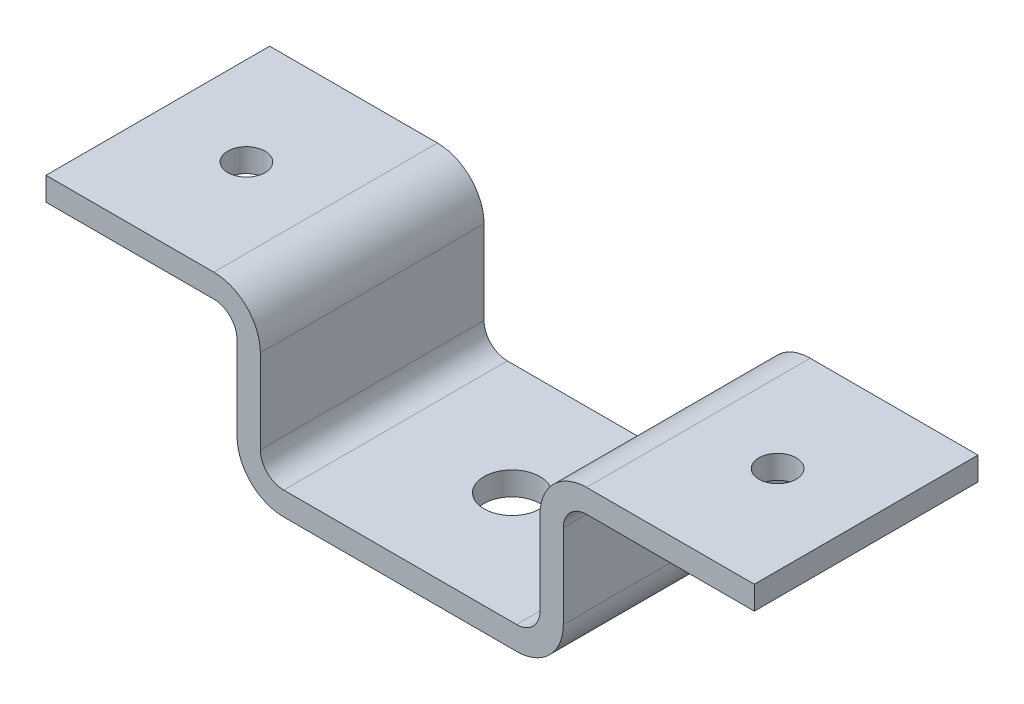
ISO-10303-21;
HEADER;
FILE_DESCRIPTION(('STEP AP214'),'2;1');
FILE_NAME('part.step','',(''),(''),'','','');
FILE_SCHEMA(('AUTOMOTIVE_DESIGN { 1 0 10303 214 1 1 1 1 }'));
ENDSEC;
DATA;
#1=APPLICATION_CONTEXT('core data for automotive mechanical design processes');
#2=APPLICATION_PROTOCOL_DEFINITION('international standard','automotive_design',2000,#1);
#3=PRODUCT_CONTEXT('',#1,'mechanical');
#4=PRODUCT('Part','Part','',(#3));
#5=PRODUCT_RELATED_PRODUCT_CATEGORY('part','',(#4));
#6=PRODUCT_DEFINITION_FORMATION('','',#4);
#7=PRODUCT_DEFINITION_CONTEXT('part definition',#1,'design');
#8=PRODUCT_DEFINITION('design','',#6,#7);
#9=PRODUCT_DEFINITION_SHAPE('','',#8);
#10=(LENGTH_UNIT() NAMED_UNIT(*) SI_UNIT(.MILLI.,.METRE.));
#11=(NAMED_UNIT(*) PLANE_ANGLE_UNIT() SI_UNIT($,.RADIAN.));
#12=(NAMED_UNIT(*) SI_UNIT($,.STERADIAN.) SOLID_ANGLE_UNIT());
#13=UNCERTAINTY_MEASURE_WITH_UNIT(LENGTH_MEASURE(1.E-05),#10,'distance_accuracy_value','');
#14=(GEOMETRIC_REPRESENTATION_CONTEXT(3) GLOBAL_UNCERTAINTY_ASSIGNED_CONTEXT((#13)) GLOBAL_UNIT_ASSIGNED_CONTEXT((#10,
#11,#12)) REPRESENTATION_CONTEXT('',''));
#15=CARTESIAN_POINT('',(0.,0.,0.));
#16=DIRECTION('',(0.,0.,1.));
#17=DIRECTION('',(1.,0.,0.));
#18=AXIS2_PLACEMENT_3D('',#15,#16,#17);
#19=CARTESIAN_POINT('',(0.,60.325,0.));
#20=DIRECTION('',(0.,-1.,0.));
#21=DIRECTION('',(0.,0.,-1.));
#22=AXIS2_PLACEMENT_3D('',#19,#20,#21);
#23=PLANE('',#22);
#24=CARTESIAN_POINT('',(30.1752,60.325,-38.1));
#25=DIRECTION('',(0.,1.,0.));
#26=DIRECTION('',(0.,0.,1.));
#27=AXIS2_PLACEMENT_3D('',#24,#25,#26);
#28=CIRCLE('',#27,6.35);
#29=CARTESIAN_POINT('',(30.1752,60.325,-31.75));
#30=VERTEX_POINT('',#29);
#31=EDGE_CURVE('E224',#30,#30,#28,.T.);
#32=ORIENTED_EDGE('',*,*,#31,.F.);
#33=EDGE_LOOP('',(#32));
#34=FACE_BOUND('',#33,.T.);
#35=DIRECTION('',(1.,0.,0.));
#36=VECTOR('',#35,1.);
#37=CARTESIAN_POINT('',(241.3,60.325,0.));
#38=LINE('',#37,#36);
#39=CARTESIAN_POINT('',(0.,60.325,0.));
#40=VERTEX_POINT('',#39);
#41=CARTESIAN_POINT('',(57.15,60.325,0.));
#42=VERTEX_POINT('',#41);
#43=EDGE_CURVE('E320',#40,#42,#38,.T.);
#44=ORIENTED_EDGE('',*,*,#43,.T.);
#45=DIRECTION('',(0.,0.,1.));
#46=VECTOR('',#45,1.);
#47=CARTESIAN_POINT('',(57.15,60.325,0.));
#48=LINE('',#47,#46);
#49=CARTESIAN_POINT('',(57.15,60.325,-76.2));
#50=VERTEX_POINT('',#49);
#51=EDGE_CURVE('E236',#42,#50,#48,.F.);
#52=ORIENTED_EDGE('',*,*,#51,.T.);
#53=DIRECTION('',(-1.,0.,0.));
#54=VECTOR('',#53,1.);
#55=CARTESIAN_POINT('',(0.,60.325,-76.2));
#56=LINE('',#55,#54);
#57=CARTESIAN_POINT('',(0.,60.325,-76.2));
#58=VERTEX_POINT('',#57);
#59=EDGE_CURVE('E326',#50,#58,#56,.T.);
#60=ORIENTED_EDGE('',*,*,#59,.T.);
#61=DIRECTION('',(0.,0.,1.));
#62=VECTOR('',#61,1.);
#63=CARTESIAN_POINT('',(0.,60.325,0.));
#64=LINE('',#63,#62);
#65=EDGE_CURVE('E207',#58,#40,#64,.T.);
#66=ORIENTED_EDGE('',*,*,#65,.T.);
#67=EDGE_LOOP('',(#44,#52,#60,#66));
#68=FACE_BOUND('',#67,.T.);
#69=ADVANCED_FACE('F43',(#34,#68),#23,.F.);
#70=CARTESIAN_POINT('',(241.3,60.325,0.));
#71=DIRECTION('',(0.,0.,-1.));
#72=DIRECTION('',(-1.,0.,0.));
#73=AXIS2_PLACEMENT_3D('',#70,#71,#72);
#74=PLANE('',#73);
#75=DIRECTION('',(0.,1.,0.));
#76=VECTOR('',#75,1.);
#77=CARTESIAN_POINT('',(65.0748,52.3748,0.));
#78=LINE('',#77,#76);
#79=CARTESIAN_POINT('',(65.0748,15.875,0.));
#80=VERTEX_POINT('',#79);
#81=CARTESIAN_POINT('',(65.0748,44.4246,0.));
#82=VERTEX_POINT('',#81);
#83=EDGE_CURVE('E194',#80,#82,#78,.T.);
#84=ORIENTED_EDGE('',*,*,#83,.F.);
#85=CARTESIAN_POINT('',(80.9498,15.875,0.));
#86=DIRECTION('',(0.,0.,-1.));
#87=DIRECTION('',(-1.,0.,0.));
#88=AXIS2_PLACEMENT_3D('',#85,#86,#87);
#89=CIRCLE('',#88,15.875);
#90=CARTESIAN_POINT('',(80.9498,0.,0.));
#91=VERTEX_POINT('',#90);
#92=EDGE_CURVE('E281',#80,#91,#89,.F.);
#93=ORIENTED_EDGE('',*,*,#92,.T.);
#94=DIRECTION('',(1.,0.,0.));
#95=VECTOR('',#94,1.);
#96=CARTESIAN_POINT('',(241.3,0.,0.));
#97=LINE('',#96,#95);
#98=CARTESIAN_POINT('',(160.3502,0.,0.));
#99=VERTEX_POINT('',#98);
#100=EDGE_CURVE('E319',#91,#99,#97,.T.);
#101=ORIENTED_EDGE('',*,*,#100,.T.);
#102=CARTESIAN_POINT('',(160.3502,15.875,0.));
#103=DIRECTION('',(0.,0.,-1.));
#104=DIRECTION('',(-1.,0.,0.));
#105=AXIS2_PLACEMENT_3D('',#102,#103,#104);
#106=CIRCLE('',#105,15.875);
#107=CARTESIAN_POINT('',(176.2252,15.875,0.));
#108=VERTEX_POINT('',#107);
#109=EDGE_CURVE('E270',#99,#108,#106,.F.);
#110=ORIENTED_EDGE('',*,*,#109,.T.);
#111=DIRECTION('',(0.,-1.,0.));
#112=VECTOR('',#111,1.);
#113=CARTESIAN_POINT('',(176.2252,52.3748,0.));
#114=LINE('',#113,#112);
#115=CARTESIAN_POINT('',(176.2252,44.4246,0.));
#116=VERTEX_POINT('',#115);
#117=EDGE_CURVE('E301',#116,#108,#114,.T.);
#118=ORIENTED_EDGE('',*,*,#117,.F.);
#119=CARTESIAN_POINT('',(184.1754,44.4246,0.));
#120=DIRECTION('',(0.,0.,-1.));
#121=DIRECTION('',(-1.,0.,0.));
#122=AXIS2_PLACEMENT_3D('',#119,#120,#121);
#123=CIRCLE('',#122,7.9502);
#124=CARTESIAN_POINT('',(184.1754,52.3748,0.));
#125=VERTEX_POINT('',#124);
#126=EDGE_CURVE('E51',#116,#125,#123,.T.);
#127=ORIENTED_EDGE('',*,*,#126,.T.);
#128=DIRECTION('',(-1.,0.,0.));
#129=VECTOR('',#128,1.);
#130=CARTESIAN_POINT('',(176.2252,52.3748,0.));
#131=LINE('',#130,#129);
#132=CARTESIAN_POINT('',(241.3,52.3748,0.));
#133=VERTEX_POINT('',#132);
#134=EDGE_CURVE('E310',#133,#125,#131,.T.);
#135=ORIENTED_EDGE('',*,*,#134,.F.);
#136=DIRECTION('',(0.,-1.,0.));
#137=VECTOR('',#136,1.);
#138=CARTESIAN_POINT('',(241.3,60.325,0.));
#139=LINE('',#138,#137);
#140=CARTESIAN_POINT('',(241.3,60.325,0.));
#141=VERTEX_POINT('',#140);
#142=EDGE_CURVE('E212',#141,#133,#139,.T.);
#143=ORIENTED_EDGE('',*,*,#142,.F.);
#144=CARTESIAN_POINT('',(184.15,60.325,0.));
#145=VERTEX_POINT('',#144);
#146=EDGE_CURVE('E324',#145,#141,#38,.T.);
#147=ORIENTED_EDGE('',*,*,#146,.F.);
#148=CARTESIAN_POINT('',(184.15,44.45,0.));
#149=DIRECTION('',(0.,0.,-1.));
#150=DIRECTION('',(-1.,0.,0.));
#151=AXIS2_PLACEMENT_3D('',#148,#149,#150);
#152=CIRCLE('',#151,15.875);
#153=CARTESIAN_POINT('',(168.275,44.45,0.));
#154=VERTEX_POINT('',#153);
#155=EDGE_CURVE('E261',#145,#154,#152,.F.);
#156=ORIENTED_EDGE('',*,*,#155,.T.);
#157=DIRECTION('',(0.,1.,0.));
#158=VECTOR('',#157,1.);
#159=CARTESIAN_POINT('',(168.275,7.9502,0.));
#160=LINE('',#159,#158);
#161=CARTESIAN_POINT('',(168.275,15.9004,0.));
#162=VERTEX_POINT('',#161);
#163=EDGE_CURVE('E353',#162,#154,#160,.T.);
#164=ORIENTED_EDGE('',*,*,#163,.F.);
#165=CARTESIAN_POINT('',(160.3248,15.9004,0.));
#166=DIRECTION('',(0.,0.,-1.));
#167=DIRECTION('',(-1.,0.,0.));
#168=AXIS2_PLACEMENT_3D('',#165,#166,#167);
#169=CIRCLE('',#168,7.9502);
#170=CARTESIAN_POINT('',(160.3248,7.9502,0.));
#171=VERTEX_POINT('',#170);
#172=EDGE_CURVE('E254',#162,#171,#169,.T.);
#173=ORIENTED_EDGE('',*,*,#172,.T.);
#174=DIRECTION('',(1.,0.,0.));
#175=VECTOR('',#174,1.);
#176=CARTESIAN_POINT('',(73.025,7.9502,0.));
#177=LINE('',#176,#175);
#178=CARTESIAN_POINT('',(80.9752,7.9502,0.));
#179=VERTEX_POINT('',#178);
#180=EDGE_CURVE('E204',#179,#171,#177,.T.);
#181=ORIENTED_EDGE('',*,*,#180,.F.);
#182=CARTESIAN_POINT('',(80.9752,15.9004,0.));
#183=DIRECTION('',(0.,0.,-1.));
#184=DIRECTION('',(-1.,0.,0.));
#185=AXIS2_PLACEMENT_3D('',#182,#183,#184);
#186=CIRCLE('',#185,7.9502);
#187=CARTESIAN_POINT('',(73.025,15.9004,0.));
#188=VERTEX_POINT('',#187);
#189=EDGE_CURVE('E245',#179,#188,#186,.T.);
#190=ORIENTED_EDGE('',*,*,#189,.T.);
#191=DIRECTION('',(0.,-1.,0.));
#192=VECTOR('',#191,1.);
#193=CARTESIAN_POINT('',(73.025,60.325,0.));
#194=LINE('',#193,#192);
#195=CARTESIAN_POINT('',(73.025,44.45,0.));
#196=VERTEX_POINT('',#195);
#197=EDGE_CURVE('E358',#196,#188,#194,.T.);
#198=ORIENTED_EDGE('',*,*,#197,.F.);
#199=CARTESIAN_POINT('',(57.15,44.45,0.));
#200=DIRECTION('',(0.,0.,-1.));
#201=DIRECTION('',(-1.,0.,0.));
#202=AXIS2_PLACEMENT_3D('',#199,#200,#201);
#203=CIRCLE('',#202,15.875);
#204=EDGE_CURVE('E234',#196,#42,#203,.F.);
#205=ORIENTED_EDGE('',*,*,#204,.T.);
#206=ORIENTED_EDGE('',*,*,#43,.F.);
#207=DIRECTION('',(0.,-1.,0.));
#208=VECTOR('',#207,1.);
#209=CARTESIAN_POINT('',(0.,60.325,0.));
#210=LINE('',#209,#208);
#211=CARTESIAN_POINT('',(0.,52.3748,0.));
#212=VERTEX_POINT('',#211);
#213=EDGE_CURVE('E209',#40,#212,#210,.T.);
#214=ORIENTED_EDGE('',*,*,#213,.T.);
#215=DIRECTION('',(-1.,0.,0.));
#216=VECTOR('',#215,1.);
#217=CARTESIAN_POINT('',(0.,52.3748,0.));
#218=LINE('',#217,#216);
#219=CARTESIAN_POINT('',(57.1246,52.3748,0.));
#220=VERTEX_POINT('',#219);
#221=EDGE_CURVE('E200',#220,#212,#218,.T.);
#222=ORIENTED_EDGE('',*,*,#221,.F.);
#223=CARTESIAN_POINT('',(57.1246,44.4246,0.));
#224=DIRECTION('',(0.,0.,-1.));
#225=DIRECTION('',(-1.,0.,0.));
#226=AXIS2_PLACEMENT_3D('',#223,#224,#225);
#227=CIRCLE('',#226,7.9502);
#228=EDGE_CURVE('E291',#220,#82,#227,.T.);
#229=ORIENTED_EDGE('',*,*,#228,.T.);
#230=EDGE_LOOP('',(#84,#93,#101,#110,#118,#127,#135,#143,#147,#156,#164,#173,#181,#190,#198,
#205,#206,#214,#222,#229));
#231=FACE_BOUND('',#230,.T.);
#232=ADVANCED_FACE('F306',(#231),#74,.F.);
#233=CARTESIAN_POINT('',(241.3,60.325,-76.2));
#234=DIRECTION('',(-1.,0.,0.));
#235=DIRECTION('',(0.,0.,1.));
#236=AXIS2_PLACEMENT_3D('',#233,#234,#235);
#237=PLANE('',#236);
#238=ORIENTED_EDGE('',*,*,#142,.T.);
#239=DIRECTION('',(0.,0.,1.));
#240=VECTOR('',#239,1.);
#241=CARTESIAN_POINT('',(241.3,52.3748,-76.2));
#242=LINE('',#241,#240);
#243=CARTESIAN_POINT('',(241.3,52.3748,-76.2));
#244=VERTEX_POINT('',#243);
#245=EDGE_CURVE('E317',#244,#133,#242,.T.);
#246=ORIENTED_EDGE('',*,*,#245,.F.);
#247=DIRECTION('',(0.,-1.,0.));
#248=VECTOR('',#247,1.);
#249=CARTESIAN_POINT('',(241.3,60.325,-76.2));
#250=LINE('',#249,#248);
#251=CARTESIAN_POINT('',(241.3,60.325,-76.2));
#252=VERTEX_POINT('',#251);
#253=EDGE_CURVE('E208',#252,#244,#250,.T.);
#254=ORIENTED_EDGE('',*,*,#253,.F.);
#255=DIRECTION('',(0.,0.,-1.));
#256=VECTOR('',#255,1.);
#257=CARTESIAN_POINT('',(241.3,60.325,-76.2));
#258=LINE('',#257,#256);
#259=EDGE_CURVE('E323',#141,#252,#258,.T.);
#260=ORIENTED_EDGE('',*,*,#259,.F.);
#261=EDGE_LOOP('',(#238,#246,#254,#260));
#262=FACE_BOUND('',#261,.T.);
#263=ADVANCED_FACE('F342',(#262),#237,.F.);
#264=CARTESIAN_POINT('',(0.,60.325,-76.2));
#265=DIRECTION('',(0.,0.,1.));
#266=DIRECTION('',(1.,0.,0.));
#267=AXIS2_PLACEMENT_3D('',#264,#265,#266);
#268=PLANE('',#267);
#269=DIRECTION('',(-1.,0.,0.));
#270=VECTOR('',#269,1.);
#271=CARTESIAN_POINT('',(0.,0.,-76.2));
#272=LINE('',#271,#270);
#273=CARTESIAN_POINT('',(160.3502,0.,-76.2));
#274=VERTEX_POINT('',#273);
#275=CARTESIAN_POINT('',(80.9498,0.,-76.2));
#276=VERTEX_POINT('',#275);
#277=EDGE_CURVE('E331',#274,#276,#272,.T.);
#278=ORIENTED_EDGE('',*,*,#277,.T.);
#279=CARTESIAN_POINT('',(80.9498,15.875,-76.2));
#280=DIRECTION('',(0.,0.,1.));
#281=DIRECTION('',(1.,0.,0.));
#282=AXIS2_PLACEMENT_3D('',#279,#280,#281);
#283=CIRCLE('',#282,15.875);
#284=CARTESIAN_POINT('',(65.0748,15.875,-76.2));
#285=VERTEX_POINT('',#284);
#286=EDGE_CURVE('E285',#276,#285,#283,.F.);
#287=ORIENTED_EDGE('',*,*,#286,.T.);
#288=DIRECTION('',(0.,1.,0.));
#289=VECTOR('',#288,1.);
#290=CARTESIAN_POINT('',(65.0748,52.3748,-76.2));
#291=LINE('',#290,#289);
#292=CARTESIAN_POINT('',(65.0748,44.4246,-76.2));
#293=VERTEX_POINT('',#292);
#294=EDGE_CURVE('E193',#285,#293,#291,.T.);
#295=ORIENTED_EDGE('',*,*,#294,.T.);
#296=CARTESIAN_POINT('',(57.1246,44.4246,-76.2));
#297=DIRECTION('',(0.,0.,1.));
#298=DIRECTION('',(1.,0.,0.));
#299=AXIS2_PLACEMENT_3D('',#296,#297,#298);
#300=CIRCLE('',#299,7.9502);
#301=CARTESIAN_POINT('',(57.1246,52.3748,-76.2));
#302=VERTEX_POINT('',#301);
#303=EDGE_CURVE('E189',#293,#302,#300,.T.);
#304=ORIENTED_EDGE('',*,*,#303,.T.);
#305=DIRECTION('',(-1.,0.,0.));
#306=VECTOR('',#305,1.);
#307=CARTESIAN_POINT('',(0.,52.3748,-76.2));
#308=LINE('',#307,#306);
#309=CARTESIAN_POINT('',(0.,52.3748,-76.2));
#310=VERTEX_POINT('',#309);
#311=EDGE_CURVE('E179',#302,#310,#308,.T.);
#312=ORIENTED_EDGE('',*,*,#311,.T.);
#313=DIRECTION('',(0.,-1.,0.));
#314=VECTOR('',#313,1.);
#315=CARTESIAN_POINT('',(0.,60.325,-76.2));
#316=LINE('',#315,#314);
#317=EDGE_CURVE('E185',#58,#310,#316,.T.);
#318=ORIENTED_EDGE('',*,*,#317,.F.);
#319=ORIENTED_EDGE('',*,*,#59,.F.);
#320=CARTESIAN_POINT('',(57.15,44.45,-76.2));
#321=DIRECTION('',(0.,0.,1.));
#322=DIRECTION('',(1.,0.,0.));
#323=AXIS2_PLACEMENT_3D('',#320,#321,#322);
#324=CIRCLE('',#323,15.875);
#325=CARTESIAN_POINT('',(73.025,44.45,-76.2));
#326=VERTEX_POINT('',#325);
#327=EDGE_CURVE('E238',#50,#326,#324,.F.);
#328=ORIENTED_EDGE('',*,*,#327,.T.);
#329=DIRECTION('',(0.,-1.,0.));
#330=VECTOR('',#329,1.);
#331=CARTESIAN_POINT('',(73.025,60.325,-76.2));
#332=LINE('',#331,#330);
#333=CARTESIAN_POINT('',(73.025,15.9004,-76.2));
#334=VERTEX_POINT('',#333);
#335=EDGE_CURVE('E313',#326,#334,#332,.T.);
#336=ORIENTED_EDGE('',*,*,#335,.T.);
#337=CARTESIAN_POINT('',(80.9752,15.9004,-76.2));
#338=DIRECTION('',(0.,0.,1.));
#339=DIRECTION('',(1.,0.,0.));
#340=AXIS2_PLACEMENT_3D('',#337,#338,#339);
#341=CIRCLE('',#340,7.9502);
#342=CARTESIAN_POINT('',(80.9752,7.9502,-76.2));
#343=VERTEX_POINT('',#342);
#344=EDGE_CURVE('E247',#334,#343,#341,.T.);
#345=ORIENTED_EDGE('',*,*,#344,.T.);
#346=DIRECTION('',(1.,0.,0.));
#347=VECTOR('',#346,1.);
#348=CARTESIAN_POINT('',(73.025,7.9502,-76.2));
#349=LINE('',#348,#347);
#350=CARTESIAN_POINT('',(160.3248,7.9502,-76.2));
#351=VERTEX_POINT('',#350);
#352=EDGE_CURVE('E361',#343,#351,#349,.T.);
#353=ORIENTED_EDGE('',*,*,#352,.T.);
#354=CARTESIAN_POINT('',(160.3248,15.9004,-76.2));
#355=DIRECTION('',(0.,0.,1.));
#356=DIRECTION('',(1.,0.,0.));
#357=AXIS2_PLACEMENT_3D('',#354,#355,#356);
#358=CIRCLE('',#357,7.9502);
#359=CARTESIAN_POINT('',(168.275,15.9004,-76.2));
#360=VERTEX_POINT('',#359);
#361=EDGE_CURVE('E256',#351,#360,#358,.T.);
#362=ORIENTED_EDGE('',*,*,#361,.T.);
#363=DIRECTION('',(0.,1.,0.));
#364=VECTOR('',#363,1.);
#365=CARTESIAN_POINT('',(168.275,7.9502,-76.2));
#366=LINE('',#365,#364);
#367=CARTESIAN_POINT('',(168.275,44.45,-76.2));
#368=VERTEX_POINT('',#367);
#369=EDGE_CURVE('E368',#360,#368,#366,.T.);
#370=ORIENTED_EDGE('',*,*,#369,.T.);
#371=CARTESIAN_POINT('',(184.15,44.45,-76.2));
#372=DIRECTION('',(0.,0.,1.));
#373=DIRECTION('',(1.,0.,0.));
#374=AXIS2_PLACEMENT_3D('',#371,#372,#373);
#375=CIRCLE('',#374,15.875);
#376=CARTESIAN_POINT('',(184.15,60.325,-76.2));
#377=VERTEX_POINT('',#376);
#378=EDGE_CURVE('E265',#368,#377,#375,.F.);
#379=ORIENTED_EDGE('',*,*,#378,.T.);
#380=EDGE_CURVE('E327',#252,#377,#56,.T.);
#381=ORIENTED_EDGE('',*,*,#380,.F.);
#382=ORIENTED_EDGE('',*,*,#253,.T.);
#383=DIRECTION('',(-1.,0.,0.));
#384=VECTOR('',#383,1.);
#385=CARTESIAN_POINT('',(176.2252,52.3748,-76.2));
#386=LINE('',#385,#384);
#387=CARTESIAN_POINT('',(184.1754,52.3748,-76.2));
#388=VERTEX_POINT('',#387);
#389=EDGE_CURVE('E309',#244,#388,#386,.T.);
#390=ORIENTED_EDGE('',*,*,#389,.T.);
#391=CARTESIAN_POINT('',(184.1754,44.4246,-76.2));
#392=DIRECTION('',(0.,0.,1.));
#393=DIRECTION('',(1.,0.,0.));
#394=AXIS2_PLACEMENT_3D('',#391,#392,#393);
#395=CIRCLE('',#394,7.9502);
#396=CARTESIAN_POINT('',(176.2252,44.4246,-76.2));
#397=VERTEX_POINT('',#396);
#398=EDGE_CURVE('E11',#388,#397,#395,.T.);
#399=ORIENTED_EDGE('',*,*,#398,.T.);
#400=DIRECTION('',(0.,-1.,0.));
#401=VECTOR('',#400,1.);
#402=CARTESIAN_POINT('',(176.2252,52.3748,-76.2));
#403=LINE('',#402,#401);
#404=CARTESIAN_POINT('',(176.2252,15.875,-76.2));
#405=VERTEX_POINT('',#404);
#406=EDGE_CURVE('E302',#397,#405,#403,.T.);
#407=ORIENTED_EDGE('',*,*,#406,.T.);
#408=CARTESIAN_POINT('',(160.3502,15.875,-76.2));
#409=DIRECTION('',(0.,0.,1.));
#410=DIRECTION('',(1.,0.,0.));
#411=AXIS2_PLACEMENT_3D('',#408,#409,#410);
#412=CIRCLE('',#411,15.875);
#413=EDGE_CURVE('E276',#405,#274,#412,.F.);
#414=ORIENTED_EDGE('',*,*,#413,.T.);
#415=EDGE_LOOP('',(#278,#287,#295,#304,#312,#318,#319,#328,#336,#345,#353,#362,#370,#379,#381,
#382,#390,#399,#407,#414));
#416=FACE_BOUND('',#415,.T.);
#417=ADVANCED_FACE('F182',(#416),#268,.F.);
#418=CARTESIAN_POINT('',(0.,60.325,0.));
#419=DIRECTION('',(1.,0.,0.));
#420=DIRECTION('',(0.,0.,-1.));
#421=AXIS2_PLACEMENT_3D('',#418,#419,#420);
#422=PLANE('',#421);
#423=ORIENTED_EDGE('',*,*,#317,.T.);
#424=DIRECTION('',(0.,0.,1.));
#425=VECTOR('',#424,1.);
#426=CARTESIAN_POINT('',(0.,52.3748,-76.2));
#427=LINE('',#426,#425);
#428=EDGE_CURVE('E197',#310,#212,#427,.T.);
#429=ORIENTED_EDGE('',*,*,#428,.T.);
#430=ORIENTED_EDGE('',*,*,#213,.F.);
#431=ORIENTED_EDGE('',*,*,#65,.F.);
#432=EDGE_LOOP('',(#423,#429,#430,#431));
#433=FACE_BOUND('',#432,.T.);
#434=ADVANCED_FACE('F206',(#433),#422,.F.);
#435=CARTESIAN_POINT('',(211.1248,60.325,-38.1));
#436=DIRECTION('',(0.,1.,0.));
#437=DIRECTION('',(0.,0.,1.));
#438=AXIS2_PLACEMENT_3D('',#435,#436,#437);
#439=CIRCLE('',#438,6.35);
#440=CARTESIAN_POINT('',(211.1248,60.325,-31.75));
#441=VERTEX_POINT('',#440);
#442=EDGE_CURVE('E230',#441,#441,#439,.T.);
#443=ORIENTED_EDGE('',*,*,#442,.F.);
#444=EDGE_LOOP('',(#443));
#445=FACE_BOUND('',#444,.T.);
#446=ORIENTED_EDGE('',*,*,#380,.T.);
#447=DIRECTION('',(0.,0.,1.));
#448=VECTOR('',#447,1.);
#449=CARTESIAN_POINT('',(184.15,60.325,0.));
#450=LINE('',#449,#448);
#451=EDGE_CURVE('E258',#377,#145,#450,.T.);
#452=ORIENTED_EDGE('',*,*,#451,.T.);
#453=ORIENTED_EDGE('',*,*,#146,.T.);
#454=ORIENTED_EDGE('',*,*,#259,.T.);
#455=EDGE_LOOP('',(#446,#452,#453,#454));
#456=FACE_BOUND('',#455,.T.);
#457=ADVANCED_FACE('F337',(#445,#456),#23,.F.);
#458=CARTESIAN_POINT('',(0.,0.,0.));
#459=DIRECTION('',(0.,-1.,0.));
#460=DIRECTION('',(0.,0.,-1.));
#461=AXIS2_PLACEMENT_3D('',#458,#459,#460);
#462=PLANE('',#461);
#463=CARTESIAN_POINT('',(120.65,0.,-38.1));
#464=DIRECTION('',(0.,1.,0.));
#465=DIRECTION('',(0.,0.,1.));
#466=AXIS2_PLACEMENT_3D('',#463,#464,#465);
#467=CIRCLE('',#466,9.525);
#468=CARTESIAN_POINT('',(120.65,0.,-28.575));
#469=VERTEX_POINT('',#468);
#470=EDGE_CURVE('E231',#469,#469,#467,.T.);
#471=ORIENTED_EDGE('',*,*,#470,.T.);
#472=EDGE_LOOP('',(#471));
#473=FACE_BOUND('',#472,.T.);
#474=ORIENTED_EDGE('',*,*,#100,.F.);
#475=DIRECTION('',(0.,0.,1.));
#476=VECTOR('',#475,1.);
#477=CARTESIAN_POINT('',(80.9498,0.,-76.2));
#478=LINE('',#477,#476);
#479=EDGE_CURVE('E283',#91,#276,#478,.F.);
#480=ORIENTED_EDGE('',*,*,#479,.T.);
#481=ORIENTED_EDGE('',*,*,#277,.F.);
#482=DIRECTION('',(0.,0.,1.));
#483=VECTOR('',#482,1.);
#484=CARTESIAN_POINT('',(160.3502,0.,0.));
#485=LINE('',#484,#483);
#486=EDGE_CURVE('E267',#274,#99,#485,.T.);
#487=ORIENTED_EDGE('',*,*,#486,.T.);
#488=EDGE_LOOP('',(#474,#480,#481,#487));
#489=FACE_BOUND('',#488,.T.);
#490=ADVANCED_FACE('F383',(#473,#489),#462,.T.);
#491=CARTESIAN_POINT('',(176.2252,52.3748,-76.2));
#492=DIRECTION('',(0.,1.,0.));
#493=DIRECTION('',(0.,0.,1.));
#494=AXIS2_PLACEMENT_3D('',#491,#492,#493);
#495=PLANE('',#494);
#496=CARTESIAN_POINT('',(211.1248,52.3748,-38.1));
#497=DIRECTION('',(0.,1.,0.));
#498=DIRECTION('',(0.,0.,1.));
#499=AXIS2_PLACEMENT_3D('',#496,#497,#498);
#500=CIRCLE('',#499,6.35);
#501=CARTESIAN_POINT('',(211.1248,52.3748,-31.75));
#502=VERTEX_POINT('',#501);
#503=EDGE_CURVE('E223',#502,#502,#500,.T.);
#504=ORIENTED_EDGE('',*,*,#503,.T.);
#505=EDGE_LOOP('',(#504));
#506=FACE_BOUND('',#505,.T.);
#507=ORIENTED_EDGE('',*,*,#134,.T.);
#508=DIRECTION('',(0.,0.,1.));
#509=VECTOR('',#508,1.);
#510=CARTESIAN_POINT('',(184.1754,52.3748,-76.2));
#511=LINE('',#510,#509);
#512=EDGE_CURVE('E58',#125,#388,#511,.F.);
#513=ORIENTED_EDGE('',*,*,#512,.T.);
#514=ORIENTED_EDGE('',*,*,#389,.F.);
#515=ORIENTED_EDGE('',*,*,#245,.T.);
#516=EDGE_LOOP('',(#507,#513,#514,#515));
#517=FACE_BOUND('',#516,.T.);
#518=ADVANCED_FACE('F345',(#506,#517),#495,.F.);
#519=CARTESIAN_POINT('',(176.2252,52.3748,-76.2));
#520=DIRECTION('',(-1.,0.,0.));
#521=DIRECTION('',(0.,-1.,0.));
#522=AXIS2_PLACEMENT_3D('',#519,#520,#521);
#523=PLANE('',#522);
#524=ORIENTED_EDGE('',*,*,#406,.F.);
#525=DIRECTION('',(0.,0.,1.));
#526=VECTOR('',#525,1.);
#527=CARTESIAN_POINT('',(176.2252,44.4246,0.));
#528=LINE('',#527,#526);
#529=EDGE_CURVE('E294',#397,#116,#528,.T.);
#530=ORIENTED_EDGE('',*,*,#529,.T.);
#531=ORIENTED_EDGE('',*,*,#117,.T.);
#532=DIRECTION('',(0.,0.,1.));
#533=VECTOR('',#532,1.);
#534=CARTESIAN_POINT('',(176.2252,15.875,-76.2));
#535=LINE('',#534,#533);
#536=EDGE_CURVE('E273',#108,#405,#535,.F.);
#537=ORIENTED_EDGE('',*,*,#536,.T.);
#538=EDGE_LOOP('',(#524,#530,#531,#537));
#539=FACE_BOUND('',#538,.T.);
#540=ADVANCED_FACE('F300',(#539),#523,.F.);
#541=CARTESIAN_POINT('',(73.025,7.9502,-76.2));
#542=DIRECTION('',(0.,-1.,0.));
#543=DIRECTION('',(0.,0.,-1.));
#544=AXIS2_PLACEMENT_3D('',#541,#542,#543);
#545=PLANE('',#544);
#546=CARTESIAN_POINT('',(120.65,7.9502,-38.1));
#547=DIRECTION('',(0.,-1.,0.));
#548=DIRECTION('',(0.,0.,-1.));
#549=AXIS2_PLACEMENT_3D('',#546,#547,#548);
#550=CIRCLE('',#549,9.525);
#551=CARTESIAN_POINT('',(120.65,7.9502,-28.575));
#552=VERTEX_POINT('',#551);
#553=EDGE_CURVE('E227',#552,#552,#550,.T.);
#554=ORIENTED_EDGE('',*,*,#553,.T.);
#555=EDGE_LOOP('',(#554));
#556=FACE_BOUND('',#555,.T.);
#557=ORIENTED_EDGE('',*,*,#180,.T.);
#558=DIRECTION('',(0.,0.,1.));
#559=VECTOR('',#558,1.);
#560=CARTESIAN_POINT('',(160.3248,7.9502,-76.2));
#561=LINE('',#560,#559);
#562=EDGE_CURVE('E252',#171,#351,#561,.F.);
#563=ORIENTED_EDGE('',*,*,#562,.T.);
#564=ORIENTED_EDGE('',*,*,#352,.F.);
#565=DIRECTION('',(0.,0.,1.));
#566=VECTOR('',#565,1.);
#567=CARTESIAN_POINT('',(80.9752,7.9502,0.));
#568=LINE('',#567,#566);
#569=EDGE_CURVE('E240',#343,#179,#568,.T.);
#570=ORIENTED_EDGE('',*,*,#569,.T.);
#571=EDGE_LOOP('',(#557,#563,#564,#570));
#572=FACE_BOUND('',#571,.T.);
#573=ADVANCED_FACE('F394',(#556,#572),#545,.F.);
#574=CARTESIAN_POINT('',(73.025,60.325,-76.2));
#575=DIRECTION('',(-1.,0.,0.));
#576=DIRECTION('',(0.,0.,1.));
#577=AXIS2_PLACEMENT_3D('',#574,#575,#576);
#578=PLANE('',#577);
#579=ORIENTED_EDGE('',*,*,#197,.T.);
#580=DIRECTION('',(0.,0.,1.));
#581=VECTOR('',#580,1.);
#582=CARTESIAN_POINT('',(73.025,15.9004,-76.2));
#583=LINE('',#582,#581);
#584=EDGE_CURVE('E243',#188,#334,#583,.F.);
#585=ORIENTED_EDGE('',*,*,#584,.T.);
#586=ORIENTED_EDGE('',*,*,#335,.F.);
#587=DIRECTION('',(0.,0.,1.));
#588=VECTOR('',#587,1.);
#589=CARTESIAN_POINT('',(73.025,44.45,-76.2));
#590=LINE('',#589,#588);
#591=EDGE_CURVE('E219',#326,#196,#590,.T.);
#592=ORIENTED_EDGE('',*,*,#591,.T.);
#593=EDGE_LOOP('',(#579,#585,#586,#592));
#594=FACE_BOUND('',#593,.T.);
#595=ADVANCED_FACE('F397',(#594),#578,.F.);
#596=CARTESIAN_POINT('',(168.275,7.9502,-76.2));
#597=DIRECTION('',(1.,0.,0.));
#598=DIRECTION('',(0.,0.,-1.));
#599=AXIS2_PLACEMENT_3D('',#596,#597,#598);
#600=PLANE('',#599);
#601=ORIENTED_EDGE('',*,*,#163,.T.);
#602=DIRECTION('',(0.,0.,1.));
#603=VECTOR('',#602,1.);
#604=CARTESIAN_POINT('',(168.275,44.45,-76.2));
#605=LINE('',#604,#603);
#606=EDGE_CURVE('E263',#154,#368,#605,.F.);
#607=ORIENTED_EDGE('',*,*,#606,.T.);
#608=ORIENTED_EDGE('',*,*,#369,.F.);
#609=DIRECTION('',(0.,0.,1.));
#610=VECTOR('',#609,1.);
#611=CARTESIAN_POINT('',(168.275,15.9004,0.));
#612=LINE('',#611,#610);
#613=EDGE_CURVE('E249',#360,#162,#612,.T.);
#614=ORIENTED_EDGE('',*,*,#613,.T.);
#615=EDGE_LOOP('',(#601,#607,#608,#614));
#616=FACE_BOUND('',#615,.T.);
#617=ADVANCED_FACE('F355',(#616),#600,.F.);
#618=CARTESIAN_POINT('',(0.,52.3748,-76.2));
#619=DIRECTION('',(0.,1.,0.));
#620=DIRECTION('',(0.,0.,1.));
#621=AXIS2_PLACEMENT_3D('',#618,#619,#620);
#622=PLANE('',#621);
#623=CARTESIAN_POINT('',(30.1752,52.3748,-38.1));
#624=DIRECTION('',(0.,1.,0.));
#625=DIRECTION('',(0.,0.,1.));
#626=AXIS2_PLACEMENT_3D('',#623,#624,#625);
#627=CIRCLE('',#626,6.35);
#628=CARTESIAN_POINT('',(30.1752,52.3748,-31.75));
#629=VERTEX_POINT('',#628);
#630=EDGE_CURVE('E220',#629,#629,#627,.T.);
#631=ORIENTED_EDGE('',*,*,#630,.T.);
#632=EDGE_LOOP('',(#631));
#633=FACE_BOUND('',#632,.T.);
#634=ORIENTED_EDGE('',*,*,#311,.F.);
#635=DIRECTION('',(0.,0.,1.));
#636=VECTOR('',#635,1.);
#637=CARTESIAN_POINT('',(57.1246,52.3748,0.));
#638=LINE('',#637,#636);
#639=EDGE_CURVE('E287',#302,#220,#638,.T.);
#640=ORIENTED_EDGE('',*,*,#639,.T.);
#641=ORIENTED_EDGE('',*,*,#221,.T.);
#642=ORIENTED_EDGE('',*,*,#428,.F.);
#643=EDGE_LOOP('',(#634,#640,#641,#642));
#644=FACE_BOUND('',#643,.T.);
#645=ADVANCED_FACE('F198',(#633,#644),#622,.F.);
#646=CARTESIAN_POINT('',(65.0748,52.3748,-76.2));
#647=DIRECTION('',(1.,0.,0.));
#648=DIRECTION('',(0.,0.,-1.));
#649=AXIS2_PLACEMENT_3D('',#646,#647,#648);
#650=PLANE('',#649);
#651=ORIENTED_EDGE('',*,*,#83,.T.);
#652=DIRECTION('',(0.,0.,1.));
#653=VECTOR('',#652,1.);
#654=CARTESIAN_POINT('',(65.0748,44.4246,-76.2));
#655=LINE('',#654,#653);
#656=EDGE_CURVE('E289',#82,#293,#655,.F.);
#657=ORIENTED_EDGE('',*,*,#656,.T.);
#658=ORIENTED_EDGE('',*,*,#294,.F.);
#659=DIRECTION('',(0.,0.,1.));
#660=VECTOR('',#659,1.);
#661=CARTESIAN_POINT('',(65.0748,15.875,0.));
#662=LINE('',#661,#660);
#663=EDGE_CURVE('E278',#285,#80,#662,.T.);
#664=ORIENTED_EDGE('',*,*,#663,.T.);
#665=EDGE_LOOP('',(#651,#657,#658,#664));
#666=FACE_BOUND('',#665,.T.);
#667=ADVANCED_FACE('F422',(#666),#650,.F.);
#668=CARTESIAN_POINT('',(30.1752,0.,-38.1));
#669=DIRECTION('',(0.,1.,0.));
#670=DIRECTION('',(0.,0.,1.));
#671=AXIS2_PLACEMENT_3D('',#668,#669,#670);
#672=CYLINDRICAL_SURFACE('',#671,6.35);
#673=CARTESIAN_POINT('',(30.1752,60.325,-31.75));
#674=CARTESIAN_POINT('',(30.1752,60.2421854166667,-31.75));
#675=CARTESIAN_POINT('',(30.1752,60.1593708333333,-31.75));
#676=CARTESIAN_POINT('',(30.1752,59.9937416666667,-31.75));
#677=CARTESIAN_POINT('',(30.1752,59.9109270833333,-31.75));
#678=CARTESIAN_POINT('',(30.1752,59.7452979166667,-31.75));
#679=CARTESIAN_POINT('',(30.1752,59.6624833333333,-31.75));
#680=CARTESIAN_POINT('',(30.1752,59.4968541666667,-31.75));
#681=CARTESIAN_POINT('',(30.1752,59.4140395833333,-31.75));
#682=CARTESIAN_POINT('',(30.1752,59.2484104166667,-31.75));
#683=CARTESIAN_POINT('',(30.1752,59.1655958333333,-31.75));
#684=CARTESIAN_POINT('',(30.1752,58.9999666666667,-31.75));
#685=CARTESIAN_POINT('',(30.1752,58.9171520833333,-31.75));
#686=CARTESIAN_POINT('',(30.1752,58.7515229166667,-31.75));
#687=CARTESIAN_POINT('',(30.1752,58.6687083333333,-31.75));
#688=CARTESIAN_POINT('',(30.1752,58.5030791666667,-31.75));
#689=CARTESIAN_POINT('',(30.1752,58.4202645833333,-31.75));
#690=CARTESIAN_POINT('',(30.1752,58.2546354166667,-31.75));
#691=CARTESIAN_POINT('',(30.1752,58.1718208333333,-31.75));
#692=CARTESIAN_POINT('',(30.1752,58.0061916666667,-31.75));
#693=CARTESIAN_POINT('',(30.1752,57.9233770833333,-31.75));
#694=CARTESIAN_POINT('',(30.1752,57.7577479166667,-31.75));
#695=CARTESIAN_POINT('',(30.1752,57.6749333333333,-31.75));
#696=CARTESIAN_POINT('',(30.1752,57.5093041666667,-31.75));
#697=CARTESIAN_POINT('',(30.1752,57.4264895833333,-31.75));
#698=CARTESIAN_POINT('',(30.1752,57.2608604166667,-31.75));
#699=CARTESIAN_POINT('',(30.1752,57.1780458333333,-31.75));
#700=CARTESIAN_POINT('',(30.1752,57.0124166666667,-31.75));
#701=CARTESIAN_POINT('',(30.1752,56.9296020833333,-31.75));
#702=CARTESIAN_POINT('',(30.1752,56.7639729166667,-31.75));
#703=CARTESIAN_POINT('',(30.1752,56.6811583333333,-31.75));
#704=CARTESIAN_POINT('',(30.1752,56.5155291666667,-31.75));
#705=CARTESIAN_POINT('',(30.1752,56.4327145833333,-31.75));
#706=CARTESIAN_POINT('',(30.1752,56.2670854166667,-31.75));
#707=CARTESIAN_POINT('',(30.1752,56.1842708333333,-31.75));
#708=CARTESIAN_POINT('',(30.1752,56.0186416666667,-31.75));
#709=CARTESIAN_POINT('',(30.1752,55.9358270833333,-31.75));
#710=CARTESIAN_POINT('',(30.1752,55.7701979166667,-31.75));
#711=CARTESIAN_POINT('',(30.1752,55.6873833333333,-31.75));
#712=CARTESIAN_POINT('',(30.1752,55.5217541666667,-31.75));
#713=CARTESIAN_POINT('',(30.1752,55.4389395833333,-31.75));
#714=CARTESIAN_POINT('',(30.1752,55.2733104166667,-31.75));
#715=CARTESIAN_POINT('',(30.1752,55.1904958333333,-31.75));
#716=CARTESIAN_POINT('',(30.1752,55.0248666666667,-31.75));
#717=CARTESIAN_POINT('',(30.1752,54.9420520833333,-31.75));
#718=CARTESIAN_POINT('',(30.1752,54.7764229166667,-31.75));
#719=CARTESIAN_POINT('',(30.1752,54.6936083333333,-31.75));
#720=CARTESIAN_POINT('',(30.1752,54.5279791666667,-31.75));
#721=CARTESIAN_POINT('',(30.1752,54.4451645833333,-31.75));
#722=CARTESIAN_POINT('',(30.1752,54.2795354166667,-31.75));
#723=CARTESIAN_POINT('',(30.1752,54.1967208333333,-31.75));
#724=CARTESIAN_POINT('',(30.1752,54.0310916666667,-31.75));
#725=CARTESIAN_POINT('',(30.1752,53.9482770833333,-31.75));
#726=CARTESIAN_POINT('',(30.1752,53.7826479166667,-31.75));
#727=CARTESIAN_POINT('',(30.1752,53.6998333333333,-31.75));
#728=CARTESIAN_POINT('',(30.1752,53.5342041666667,-31.75));
#729=CARTESIAN_POINT('',(30.1752,53.4513895833333,-31.75));
#730=CARTESIAN_POINT('',(30.1752,53.2857604166667,-31.75));
#731=CARTESIAN_POINT('',(30.1752,53.2029458333333,-31.75));
#732=CARTESIAN_POINT('',(30.1752,53.0373166666667,-31.75));
#733=CARTESIAN_POINT('',(30.1752,52.9545020833333,-31.75));
#734=CARTESIAN_POINT('',(30.1752,52.7888729166667,-31.75));
#735=CARTESIAN_POINT('',(30.1752,52.7060583333333,-31.75));
#736=CARTESIAN_POINT('',(30.1752,52.5404291666667,-31.75));
#737=CARTESIAN_POINT('',(30.1752,52.4576145833333,-31.75));
#738=CARTESIAN_POINT('',(30.1752,52.3748,-31.75));
#739=B_SPLINE_CURVE_WITH_KNOTS('',3,(#673,#674,#675,#676,#677,#678,#679,#680,#681,#682,#683,
#684,#685,#686,#687,#688,#689,#690,#691,#692,#693,#694,#695,#696,#697,#698,#699,#700,#701,#702,
#703,#704,#705,#706,#707,#708,#709,#710,#711,#712,#713,#714,#715,#716,#717,#718,#719,#720,#721,
#722,#723,#724,#725,#726,#727,#728,#729,#730,#731,#732,#733,#734,#735,#736,#737,#738),
.UNSPECIFIED.,.F.,.F.,(4,2,2,2,2,2,2,2,2,2,2,2,2,2,2,2,2,2,2,2,2,2,2,2,2,2,2,2,2,2,2,2,4),(0.,
0.248443750000001,0.496887500000001,0.745331250000002,0.993775000000002,1.24221875,1.4906625,
1.73910625,1.98755,2.23599375,2.4844375,2.73288125,2.981325,3.22976875,3.4782125,3.72665625,
3.9751,4.22354375,4.4719875,4.72043125,4.968875,5.21731875,5.46576250000001,5.71420625000001,
5.96265,6.21109375000001,6.4595375,6.70798125,6.956425,7.20486875,7.4533125,7.70175625,7.9502),.UNSPECIFIED.);
#740=EDGE_CURVE('BSEAM460',#30,#629,#739,.T.);
#741=ORIENTED_EDGE('',*,*,#31,.T.);
#742=ORIENTED_EDGE('',*,*,#630,.F.);
#743=ORIENTED_EDGE('',*,*,#740,.T.);
#744=ORIENTED_EDGE('',*,*,#740,.F.);
#745=EDGE_LOOP('',(#741,#743,#742,#744));
#746=FACE_BOUND('',#745,.T.);
#747=ADVANCED_FACE('F460',(#746),#672,.F.);
#748=CARTESIAN_POINT('',(211.1248,0.,-38.1));
#749=DIRECTION('',(0.,1.,0.));
#750=DIRECTION('',(0.,0.,1.));
#751=AXIS2_PLACEMENT_3D('',#748,#749,#750);
#752=CYLINDRICAL_SURFACE('',#751,6.35);
#753=CARTESIAN_POINT('',(211.1248,60.325,-31.75));
#754=CARTESIAN_POINT('',(211.1248,60.2421854166667,-31.75));
#755=CARTESIAN_POINT('',(211.1248,60.1593708333333,-31.75));
#756=CARTESIAN_POINT('',(211.1248,59.9937416666667,-31.75));
#757=CARTESIAN_POINT('',(211.1248,59.9109270833333,-31.75));
#758=CARTESIAN_POINT('',(211.1248,59.7452979166667,-31.75));
#759=CARTESIAN_POINT('',(211.1248,59.6624833333333,-31.75));
#760=CARTESIAN_POINT('',(211.1248,59.4968541666667,-31.75));
#761=CARTESIAN_POINT('',(211.1248,59.4140395833333,-31.75));
#762=CARTESIAN_POINT('',(211.1248,59.2484104166667,-31.75));
#763=CARTESIAN_POINT('',(211.1248,59.1655958333333,-31.75));
#764=CARTESIAN_POINT('',(211.1248,58.9999666666667,-31.75));
#765=CARTESIAN_POINT('',(211.1248,58.9171520833333,-31.75));
#766=CARTESIAN_POINT('',(211.1248,58.7515229166667,-31.75));
#767=CARTESIAN_POINT('',(211.1248,58.6687083333333,-31.75));
#768=CARTESIAN_POINT('',(211.1248,58.5030791666667,-31.75));
#769=CARTESIAN_POINT('',(211.1248,58.4202645833333,-31.75));
#770=CARTESIAN_POINT('',(211.1248,58.2546354166667,-31.75));
#771=CARTESIAN_POINT('',(211.1248,58.1718208333333,-31.75));
#772=CARTESIAN_POINT('',(211.1248,58.0061916666667,-31.75));
#773=CARTESIAN_POINT('',(211.1248,57.9233770833333,-31.75));
#774=CARTESIAN_POINT('',(211.1248,57.7577479166667,-31.75));
#775=CARTESIAN_POINT('',(211.1248,57.6749333333333,-31.75));
#776=CARTESIAN_POINT('',(211.1248,57.5093041666667,-31.75));
#777=CARTESIAN_POINT('',(211.1248,57.4264895833333,-31.75));
#778=CARTESIAN_POINT('',(211.1248,57.2608604166667,-31.75));
#779=CARTESIAN_POINT('',(211.1248,57.1780458333333,-31.75));
#780=CARTESIAN_POINT('',(211.1248,57.0124166666667,-31.75));
#781=CARTESIAN_POINT('',(211.1248,56.9296020833333,-31.75));
#782=CARTESIAN_POINT('',(211.1248,56.7639729166667,-31.75));
#783=CARTESIAN_POINT('',(211.1248,56.6811583333333,-31.75));
#784=CARTESIAN_POINT('',(211.1248,56.5155291666667,-31.75));
#785=CARTESIAN_POINT('',(211.1248,56.4327145833333,-31.75));
#786=CARTESIAN_POINT('',(211.1248,56.2670854166667,-31.75));
#787=CARTESIAN_POINT('',(211.1248,56.1842708333333,-31.75));
#788=CARTESIAN_POINT('',(211.1248,56.0186416666667,-31.75));
#789=CARTESIAN_POINT('',(211.1248,55.9358270833333,-31.75));
#790=CARTESIAN_POINT('',(211.1248,55.7701979166667,-31.75));
#791=CARTESIAN_POINT('',(211.1248,55.6873833333333,-31.75));
#792=CARTESIAN_POINT('',(211.1248,55.5217541666667,-31.75));
#793=CARTESIAN_POINT('',(211.1248,55.4389395833333,-31.75));
#794=CARTESIAN_POINT('',(211.1248,55.2733104166667,-31.75));
#795=CARTESIAN_POINT('',(211.1248,55.1904958333333,-31.75));
#796=CARTESIAN_POINT('',(211.1248,55.0248666666667,-31.75));
#797=CARTESIAN_POINT('',(211.1248,54.9420520833333,-31.75));
#798=CARTESIAN_POINT('',(211.1248,54.7764229166667,-31.75));
#799=CARTESIAN_POINT('',(211.1248,54.6936083333333,-31.75));
#800=CARTESIAN_POINT('',(211.1248,54.5279791666667,-31.75));
#801=CARTESIAN_POINT('',(211.1248,54.4451645833333,-31.75));
#802=CARTESIAN_POINT('',(211.1248,54.2795354166667,-31.75));
#803=CARTESIAN_POINT('',(211.1248,54.1967208333333,-31.75));
#804=CARTESIAN_POINT('',(211.1248,54.0310916666667,-31.75));
#805=CARTESIAN_POINT('',(211.1248,53.9482770833333,-31.75));
#806=CARTESIAN_POINT('',(211.1248,53.7826479166667,-31.75));
#807=CARTESIAN_POINT('',(211.1248,53.6998333333333,-31.75));
#808=CARTESIAN_POINT('',(211.1248,53.5342041666667,-31.75));
#809=CARTESIAN_POINT('',(211.1248,53.4513895833333,-31.75));
#810=CARTESIAN_POINT('',(211.1248,53.2857604166667,-31.75));
#811=CARTESIAN_POINT('',(211.1248,53.2029458333333,-31.75));
#812=CARTESIAN_POINT('',(211.1248,53.0373166666667,-31.75));
#813=CARTESIAN_POINT('',(211.1248,52.9545020833333,-31.75));
#814=CARTESIAN_POINT('',(211.1248,52.7888729166667,-31.75));
#815=CARTESIAN_POINT('',(211.1248,52.7060583333333,-31.75));
#816=CARTESIAN_POINT('',(211.1248,52.5404291666667,-31.75));
#817=CARTESIAN_POINT('',(211.1248,52.4576145833333,-31.75));
#818=CARTESIAN_POINT('',(211.1248,52.3748,-31.75));
#819=B_SPLINE_CURVE_WITH_KNOTS('',3,(#753,#754,#755,#756,#757,#758,#759,#760,#761,#762,#763,
#764,#765,#766,#767,#768,#769,#770,#771,#772,#773,#774,#775,#776,#777,#778,#779,#780,#781,#782,
#783,#784,#785,#786,#787,#788,#789,#790,#791,#792,#793,#794,#795,#796,#797,#798,#799,#800,#801,
#802,#803,#804,#805,#806,#807,#808,#809,#810,#811,#812,#813,#814,#815,#816,#817,#818),
.UNSPECIFIED.,.F.,.F.,(4,2,2,2,2,2,2,2,2,2,2,2,2,2,2,2,2,2,2,2,2,2,2,2,2,2,2,2,2,2,2,2,4),(0.,
0.248443750000001,0.496887500000001,0.745331250000002,0.993775000000002,1.24221875,1.4906625,
1.73910625,1.98755,2.23599375,2.4844375,2.73288125,2.981325,3.22976875,3.4782125,3.72665625,
3.9751,4.22354375,4.4719875,4.72043125,4.968875,5.21731875,5.46576250000001,5.71420625000001,
5.96265,6.21109375000001,6.4595375,6.70798125,6.956425,7.20486875,7.4533125,7.70175625,7.9502),.UNSPECIFIED.);
#820=EDGE_CURVE('BSEAM390',#441,#502,#819,.T.);
#821=ORIENTED_EDGE('',*,*,#442,.T.);
#822=ORIENTED_EDGE('',*,*,#503,.F.);
#823=ORIENTED_EDGE('',*,*,#820,.T.);
#824=ORIENTED_EDGE('',*,*,#820,.F.);
#825=EDGE_LOOP('',(#821,#823,#822,#824));
#826=FACE_BOUND('',#825,.T.);
#827=ADVANCED_FACE('F390',(#826),#752,.F.);
#828=CARTESIAN_POINT('',(120.65,0.,-38.1));
#829=DIRECTION('',(0.,1.,0.));
#830=DIRECTION('',(0.,0.,1.));
#831=AXIS2_PLACEMENT_3D('',#828,#829,#830);
#832=CYLINDRICAL_SURFACE('',#831,9.525);
#833=CARTESIAN_POINT('',(120.65,0.,-28.575));
#834=CARTESIAN_POINT('',(120.65,0.0828145833333334,-28.575));
#835=CARTESIAN_POINT('',(120.65,0.165629166666667,-28.575));
#836=CARTESIAN_POINT('',(120.65,0.331258333333333,-28.575));
#837=CARTESIAN_POINT('',(120.65,0.414072916666667,-28.575));
#838=CARTESIAN_POINT('',(120.65,0.579702083333333,-28.575));
#839=CARTESIAN_POINT('',(120.65,0.662516666666667,-28.575));
#840=CARTESIAN_POINT('',(120.65,0.828145833333333,-28.575));
#841=CARTESIAN_POINT('',(120.65,0.910960416666667,-28.575));
#842=CARTESIAN_POINT('',(120.65,1.07658958333333,-28.575));
#843=CARTESIAN_POINT('',(120.65,1.15940416666667,-28.575));
#844=CARTESIAN_POINT('',(120.65,1.32503333333333,-28.575));
#845=CARTESIAN_POINT('',(120.65,1.40784791666667,-28.575));
#846=CARTESIAN_POINT('',(120.65,1.57347708333333,-28.575));
#847=CARTESIAN_POINT('',(120.65,1.65629166666667,-28.575));
#848=CARTESIAN_POINT('',(120.65,1.82192083333333,-28.575));
#849=CARTESIAN_POINT('',(120.65,1.90473541666667,-28.575));
#850=CARTESIAN_POINT('',(120.65,2.07036458333333,-28.575));
#851=CARTESIAN_POINT('',(120.65,2.15317916666667,-28.575));
#852=CARTESIAN_POINT('',(120.65,2.31880833333333,-28.575));
#853=CARTESIAN_POINT('',(120.65,2.40162291666667,-28.575));
#854=CARTESIAN_POINT('',(120.65,2.56725208333333,-28.575));
#855=CARTESIAN_POINT('',(120.65,2.65006666666667,-28.575));
#856=CARTESIAN_POINT('',(120.65,2.81569583333333,-28.575));
#857=CARTESIAN_POINT('',(120.65,2.89851041666667,-28.575));
#858=CARTESIAN_POINT('',(120.65,3.06413958333333,-28.575));
#859=CARTESIAN_POINT('',(120.65,3.14695416666667,-28.575));
#860=CARTESIAN_POINT('',(120.65,3.31258333333333,-28.575));
#861=CARTESIAN_POINT('',(120.65,3.39539791666667,-28.575));
#862=CARTESIAN_POINT('',(120.65,3.56102708333333,-28.575));
#863=CARTESIAN_POINT('',(120.65,3.64384166666667,-28.575));
#864=CARTESIAN_POINT('',(120.65,3.80947083333333,-28.575));
#865=CARTESIAN_POINT('',(120.65,3.89228541666667,-28.575));
#866=CARTESIAN_POINT('',(120.65,4.05791458333333,-28.575));
#867=CARTESIAN_POINT('',(120.65,4.14072916666667,-28.575));
#868=CARTESIAN_POINT('',(120.65,4.30635833333333,-28.575));
#869=CARTESIAN_POINT('',(120.65,4.38917291666667,-28.575));
#870=CARTESIAN_POINT('',(120.65,4.55480208333333,-28.575));
#871=CARTESIAN_POINT('',(120.65,4.63761666666667,-28.575));
#872=CARTESIAN_POINT('',(120.65,4.80324583333333,-28.575));
#873=CARTESIAN_POINT('',(120.65,4.88606041666667,-28.575));
#874=CARTESIAN_POINT('',(120.65,5.05168958333333,-28.575));
#875=CARTESIAN_POINT('',(120.65,5.13450416666667,-28.575));
#876=CARTESIAN_POINT('',(120.65,5.30013333333333,-28.575));
#877=CARTESIAN_POINT('',(120.65,5.38294791666667,-28.575));
#878=CARTESIAN_POINT('',(120.65,5.54857708333333,-28.575));
#879=CARTESIAN_POINT('',(120.65,5.63139166666667,-28.575));
#880=CARTESIAN_POINT('',(120.65,5.79702083333333,-28.575));
#881=CARTESIAN_POINT('',(120.65,5.87983541666667,-28.575));
#882=CARTESIAN_POINT('',(120.65,6.04546458333333,-28.575));
#883=CARTESIAN_POINT('',(120.65,6.12827916666667,-28.575));
#884=CARTESIAN_POINT('',(120.65,6.29390833333333,-28.575));
#885=CARTESIAN_POINT('',(120.65,6.37672291666667,-28.575));
#886=CARTESIAN_POINT('',(120.65,6.54235208333333,-28.575));
#887=CARTESIAN_POINT('',(120.65,6.62516666666667,-28.575));
#888=CARTESIAN_POINT('',(120.65,6.79079583333333,-28.575));
#889=CARTESIAN_POINT('',(120.65,6.87361041666667,-28.575));
#890=CARTESIAN_POINT('',(120.65,7.03923958333333,-28.575));
#891=CARTESIAN_POINT('',(120.65,7.12205416666667,-28.575));
#892=CARTESIAN_POINT('',(120.65,7.28768333333333,-28.575));
#893=CARTESIAN_POINT('',(120.65,7.37049791666667,-28.575));
#894=CARTESIAN_POINT('',(120.65,7.53612708333333,-28.575));
#895=CARTESIAN_POINT('',(120.65,7.61894166666667,-28.575));
#896=CARTESIAN_POINT('',(120.65,7.78457083333333,-28.575));
#897=CARTESIAN_POINT('',(120.65,7.86738541666667,-28.575));
#898=CARTESIAN_POINT('',(120.65,7.9502,-28.575));
#899=B_SPLINE_CURVE_WITH_KNOTS('',3,(#833,#834,#835,#836,#837,#838,#839,#840,#841,#842,#843,
#844,#845,#846,#847,#848,#849,#850,#851,#852,#853,#854,#855,#856,#857,#858,#859,#860,#861,#862,
#863,#864,#865,#866,#867,#868,#869,#870,#871,#872,#873,#874,#875,#876,#877,#878,#879,#880,#881,
#882,#883,#884,#885,#886,#887,#888,#889,#890,#891,#892,#893,#894,#895,#896,#897,#898),
.UNSPECIFIED.,.F.,.F.,(4,2,2,2,2,2,2,2,2,2,2,2,2,2,2,2,2,2,2,2,2,2,2,2,2,2,2,2,2,2,2,2,4),(0.,
0.24844375,0.4968875,0.74533125,0.993775,1.24221875,1.4906625,1.73910625,1.98755,2.23599375,
2.4844375,2.73288125,2.981325,3.22976875,3.4782125,3.72665625,3.9751,4.22354375,4.4719875,
4.72043125,4.968875,5.21731875,5.4657625,5.71420625,5.96265,6.21109375,6.4595375,6.70798125,
6.956425,7.20486875,7.4533125,7.70175625,7.9502),.UNSPECIFIED.);
#900=EDGE_CURVE('BSEAM386',#469,#552,#899,.T.);
#901=ORIENTED_EDGE('',*,*,#470,.F.);
#902=ORIENTED_EDGE('',*,*,#553,.F.);
#903=ORIENTED_EDGE('',*,*,#900,.T.);
#904=ORIENTED_EDGE('',*,*,#900,.F.);
#905=EDGE_LOOP('',(#901,#903,#902,#904));
#906=FACE_BOUND('',#905,.T.);
#907=ADVANCED_FACE('F386',(#906),#832,.F.);
#908=CARTESIAN_POINT('',(57.15,44.45,-76.2));
#909=DIRECTION('',(0.,0.,1.));
#910=DIRECTION('',(1.,0.,0.));
#911=AXIS2_PLACEMENT_3D('',#908,#909,#910);
#912=CYLINDRICAL_SURFACE('',#911,15.875);
#913=ORIENTED_EDGE('',*,*,#327,.F.);
#914=ORIENTED_EDGE('',*,*,#51,.F.);
#915=ORIENTED_EDGE('',*,*,#204,.F.);
#916=ORIENTED_EDGE('',*,*,#591,.F.);
#917=EDGE_LOOP('',(#913,#914,#915,#916));
#918=FACE_BOUND('',#917,.T.);
#919=ADVANCED_FACE('F389',(#918),#912,.T.);
#920=CARTESIAN_POINT('',(80.9752,15.9004,-76.2));
#921=DIRECTION('',(0.,0.,-1.));
#922=DIRECTION('',(-1.,0.,0.));
#923=AXIS2_PLACEMENT_3D('',#920,#921,#922);
#924=CYLINDRICAL_SURFACE('',#923,7.9502);
#925=ORIENTED_EDGE('',*,*,#344,.F.);
#926=ORIENTED_EDGE('',*,*,#584,.F.);
#927=ORIENTED_EDGE('',*,*,#189,.F.);
#928=ORIENTED_EDGE('',*,*,#569,.F.);
#929=EDGE_LOOP('',(#925,#926,#927,#928));
#930=FACE_BOUND('',#929,.T.);
#931=ADVANCED_FACE('F408',(#930),#924,.F.);
#932=CARTESIAN_POINT('',(160.3248,15.9004,-76.2));
#933=DIRECTION('',(0.,0.,-1.));
#934=DIRECTION('',(-1.,0.,0.));
#935=AXIS2_PLACEMENT_3D('',#932,#933,#934);
#936=CYLINDRICAL_SURFACE('',#935,7.9502);
#937=ORIENTED_EDGE('',*,*,#361,.F.);
#938=ORIENTED_EDGE('',*,*,#562,.F.);
#939=ORIENTED_EDGE('',*,*,#172,.F.);
#940=ORIENTED_EDGE('',*,*,#613,.F.);
#941=EDGE_LOOP('',(#937,#938,#939,#940));
#942=FACE_BOUND('',#941,.T.);
#943=ADVANCED_FACE('F405',(#942),#936,.F.);
#944=CARTESIAN_POINT('',(184.15,44.45,0.));
#945=DIRECTION('',(0.,0.,1.));
#946=DIRECTION('',(1.,0.,0.));
#947=AXIS2_PLACEMENT_3D('',#944,#945,#946);
#948=CYLINDRICAL_SURFACE('',#947,15.875);
#949=ORIENTED_EDGE('',*,*,#378,.F.);
#950=ORIENTED_EDGE('',*,*,#606,.F.);
#951=ORIENTED_EDGE('',*,*,#155,.F.);
#952=ORIENTED_EDGE('',*,*,#451,.F.);
#953=EDGE_LOOP('',(#949,#950,#951,#952));
#954=FACE_BOUND('',#953,.T.);
#955=ADVANCED_FACE('F349',(#954),#948,.T.);
#956=CARTESIAN_POINT('',(160.3502,15.875,0.));
#957=DIRECTION('',(0.,0.,-1.));
#958=DIRECTION('',(-1.,0.,0.));
#959=AXIS2_PLACEMENT_3D('',#956,#957,#958);
#960=CYLINDRICAL_SURFACE('',#959,15.875);
#961=ORIENTED_EDGE('',*,*,#413,.F.);
#962=ORIENTED_EDGE('',*,*,#536,.F.);
#963=ORIENTED_EDGE('',*,*,#109,.F.);
#964=ORIENTED_EDGE('',*,*,#486,.F.);
#965=EDGE_LOOP('',(#961,#962,#963,#964));
#966=FACE_BOUND('',#965,.T.);
#967=ADVANCED_FACE('F434',(#966),#960,.T.);
#968=CARTESIAN_POINT('',(80.9498,15.875,-76.2));
#969=DIRECTION('',(0.,0.,-1.));
#970=DIRECTION('',(-1.,0.,0.));
#971=AXIS2_PLACEMENT_3D('',#968,#969,#970);
#972=CYLINDRICAL_SURFACE('',#971,15.875);
#973=ORIENTED_EDGE('',*,*,#286,.F.);
#974=ORIENTED_EDGE('',*,*,#479,.F.);
#975=ORIENTED_EDGE('',*,*,#92,.F.);
#976=ORIENTED_EDGE('',*,*,#663,.F.);
#977=EDGE_LOOP('',(#973,#974,#975,#976));
#978=FACE_BOUND('',#977,.T.);
#979=ADVANCED_FACE('F427',(#978),#972,.T.);
#980=CARTESIAN_POINT('',(57.1246,44.4246,-76.2));
#981=DIRECTION('',(0.,0.,-1.));
#982=DIRECTION('',(-1.,0.,0.));
#983=AXIS2_PLACEMENT_3D('',#980,#981,#982);
#984=CYLINDRICAL_SURFACE('',#983,7.9502);
#985=ORIENTED_EDGE('',*,*,#303,.F.);
#986=ORIENTED_EDGE('',*,*,#656,.F.);
#987=ORIENTED_EDGE('',*,*,#228,.F.);
#988=ORIENTED_EDGE('',*,*,#639,.F.);
#989=EDGE_LOOP('',(#985,#986,#987,#988));
#990=FACE_BOUND('',#989,.T.);
#991=ADVANCED_FACE('F425',(#990),#984,.F.);
#992=CARTESIAN_POINT('',(184.1754,44.4246,-76.2));
#993=DIRECTION('',(0.,0.,-1.));
#994=DIRECTION('',(-1.,0.,0.));
#995=AXIS2_PLACEMENT_3D('',#992,#993,#994);
#996=CYLINDRICAL_SURFACE('',#995,7.9502);
#997=ORIENTED_EDGE('',*,*,#398,.F.);
#998=ORIENTED_EDGE('',*,*,#512,.F.);
#999=ORIENTED_EDGE('',*,*,#126,.F.);
#1000=ORIENTED_EDGE('',*,*,#529,.F.);
#1001=EDGE_LOOP('',(#997,#998,#999,#1000));
#1002=FACE_BOUND('',#1001,.T.);
#1003=ADVANCED_FACE('F45',(#1002),#996,.F.);
#1004=CLOSED_SHELL('',(#69,#232,#263,#417,#434,#457,#490,#518,#540,#573,#595,#617,#645,#667,
#747,#827,#907,#919,#931,#943,#955,#967,#979,#991,#1003));
#1005=MANIFOLD_SOLID_BREP('B2',#1004);
#1006=ADVANCED_BREP_SHAPE_REPRESENTATION('',(#18,#1005),#14);
#1007=SHAPE_DEFINITION_REPRESENTATION(#9,#1006);
ENDSEC;
END-ISO-10303-21;
